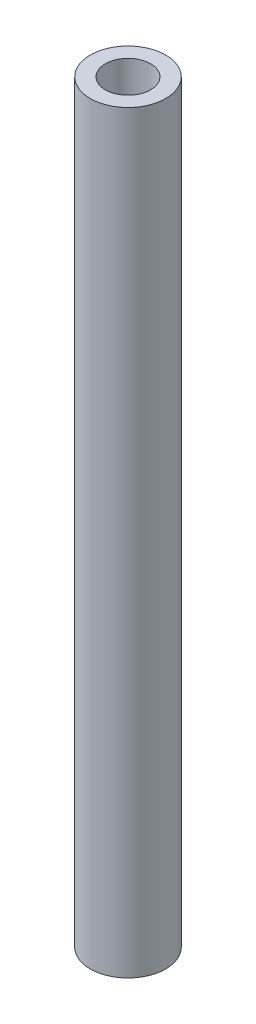
ISO-10303-21;
HEADER;
FILE_DESCRIPTION(('STEP AP214'),'2;1');
FILE_NAME('part.step','',(''),(''),'','','');
FILE_SCHEMA(('AUTOMOTIVE_DESIGN { 1 0 10303 214 1 1 1 1 }'));
ENDSEC;
DATA;
#1=APPLICATION_CONTEXT('core data for automotive mechanical design processes');
#2=APPLICATION_PROTOCOL_DEFINITION('international standard','automotive_design',2000,#1);
#3=PRODUCT_CONTEXT('',#1,'mechanical');
#4=PRODUCT('Part','Part','',(#3));
#5=PRODUCT_RELATED_PRODUCT_CATEGORY('part','',(#4));
#6=PRODUCT_DEFINITION_FORMATION('','',#4);
#7=PRODUCT_DEFINITION_CONTEXT('part definition',#1,'design');
#8=PRODUCT_DEFINITION('design','',#6,#7);
#9=PRODUCT_DEFINITION_SHAPE('','',#8);
#10=(LENGTH_UNIT() NAMED_UNIT(*) SI_UNIT(.MILLI.,.METRE.));
#11=(NAMED_UNIT(*) PLANE_ANGLE_UNIT() SI_UNIT($,.RADIAN.));
#12=(NAMED_UNIT(*) SI_UNIT($,.STERADIAN.) SOLID_ANGLE_UNIT());
#13=UNCERTAINTY_MEASURE_WITH_UNIT(LENGTH_MEASURE(1.E-05),#10,'distance_accuracy_value','');
#14=(GEOMETRIC_REPRESENTATION_CONTEXT(3) GLOBAL_UNCERTAINTY_ASSIGNED_CONTEXT((#13)) GLOBAL_UNIT_ASSIGNED_CONTEXT((#10,
#11,#12)) REPRESENTATION_CONTEXT('',''));
#15=CARTESIAN_POINT('',(0.,0.,0.));
#16=DIRECTION('',(0.,0.,1.));
#17=DIRECTION('',(1.,0.,0.));
#18=AXIS2_PLACEMENT_3D('',#15,#16,#17);
#19=CARTESIAN_POINT('',(0.,50.,0.));
#20=DIRECTION('',(0.,-1.,0.));
#21=DIRECTION('',(0.,0.,-1.));
#22=AXIS2_PLACEMENT_3D('',#19,#20,#21);
#23=CYLINDRICAL_SURFACE('',#22,2.5);
#24=CARTESIAN_POINT('',(0.,50.,0.));
#25=DIRECTION('',(0.,1.,0.));
#26=DIRECTION('',(0.,0.,1.));
#27=AXIS2_PLACEMENT_3D('',#24,#25,#26);
#28=CIRCLE('',#27,2.5);
#29=CARTESIAN_POINT('',(0.,50.,2.5));
#30=VERTEX_POINT('',#29);
#31=EDGE_CURVE('E11',#30,#30,#28,.T.);
#32=ORIENTED_EDGE('',*,*,#31,.F.);
#33=EDGE_LOOP('',(#32));
#34=FACE_BOUND('',#33,.T.);
#35=CARTESIAN_POINT('',(0.,0.,0.));
#36=DIRECTION('',(0.,1.,0.));
#37=DIRECTION('',(0.,0.,1.));
#38=AXIS2_PLACEMENT_3D('',#35,#36,#37);
#39=CIRCLE('',#38,2.5);
#40=CARTESIAN_POINT('',(0.,0.,2.5));
#41=VERTEX_POINT('',#40);
#42=EDGE_CURVE('E36',#41,#41,#39,.T.);
#43=ORIENTED_EDGE('',*,*,#42,.T.);
#44=EDGE_LOOP('',(#43));
#45=FACE_BOUND('',#44,.T.);
#46=ADVANCED_FACE('F33',(#34,#45),#23,.T.);
#47=CARTESIAN_POINT('',(0.,50.,0.));
#48=DIRECTION('',(0.,1.,0.));
#49=DIRECTION('',(0.,0.,1.));
#50=AXIS2_PLACEMENT_3D('',#47,#48,#49);
#51=PLANE('',#50);
#52=CARTESIAN_POINT('',(0.,50.,0.));
#53=DIRECTION('',(0.,1.,0.));
#54=DIRECTION('',(0.,0.,1.));
#55=AXIS2_PLACEMENT_3D('',#52,#53,#54);
#56=CIRCLE('',#55,1.50000004799999);
#57=CARTESIAN_POINT('',(0.,50.,1.50000004799999));
#58=VERTEX_POINT('',#57);
#59=EDGE_CURVE('E52',#58,#58,#56,.T.);
#60=ORIENTED_EDGE('',*,*,#59,.F.);
#61=EDGE_LOOP('',(#60));
#62=FACE_BOUND('',#61,.T.);
#63=ORIENTED_EDGE('',*,*,#31,.T.);
#64=EDGE_LOOP('',(#63));
#65=FACE_BOUND('',#64,.T.);
#66=ADVANCED_FACE('F60',(#62,#65),#51,.T.);
#67=CARTESIAN_POINT('',(0.,0.,0.));
#68=DIRECTION('',(0.,1.,0.));
#69=DIRECTION('',(0.,0.,1.));
#70=AXIS2_PLACEMENT_3D('',#67,#68,#69);
#71=PLANE('',#70);
#72=ORIENTED_EDGE('',*,*,#42,.F.);
#73=EDGE_LOOP('',(#72));
#74=FACE_BOUND('',#73,.T.);
#75=ADVANCED_FACE('F46',(#74),#71,.F.);
#76=CARTESIAN_POINT('',(0.,40.,0.));
#77=DIRECTION('',(0.,1.,0.));
#78=DIRECTION('',(0.,0.,1.));
#79=AXIS2_PLACEMENT_3D('',#76,#77,#78);
#80=CONICAL_SURFACE('',#79,1.50000004799999,1.02974425867665);
#81=CARTESIAN_POINT('',(0.,39.0987090426174,0.));
#82=VERTEX_POINT('',#81);
#83=VERTEX_LOOP('',#82);
#84=FACE_BOUND('',#83,.T.);
#85=CARTESIAN_POINT('',(0.,40.,0.));
#86=DIRECTION('',(0.,1.,0.));
#87=DIRECTION('',(0.,0.,1.));
#88=AXIS2_PLACEMENT_3D('',#85,#86,#87);
#89=CIRCLE('',#88,1.50000004799999);
#90=CARTESIAN_POINT('',(0.,40.,1.50000004799999));
#91=VERTEX_POINT('',#90);
#92=EDGE_CURVE('E50',#91,#91,#89,.T.);
#93=ORIENTED_EDGE('',*,*,#92,.T.);
#94=EDGE_LOOP('',(#93));
#95=FACE_BOUND('',#94,.T.);
#96=ADVANCED_FACE('F42',(#84,#95),#80,.F.);
#97=CARTESIAN_POINT('',(0.,50.,0.));
#98=DIRECTION('',(0.,1.,0.));
#99=DIRECTION('',(0.,0.,1.));
#100=AXIS2_PLACEMENT_3D('',#97,#98,#99);
#101=CYLINDRICAL_SURFACE('',#100,1.50000004799999);
#102=ORIENTED_EDGE('',*,*,#92,.F.);
#103=EDGE_LOOP('',(#102));
#104=FACE_BOUND('',#103,.T.);
#105=ORIENTED_EDGE('',*,*,#59,.T.);
#106=EDGE_LOOP('',(#105));
#107=FACE_BOUND('',#106,.T.);
#108=ADVANCED_FACE('F45',(#104,#107),#101,.F.);
#109=CLOSED_SHELL('',(#46,#66,#75,#96,#108));
#110=MANIFOLD_SOLID_BREP('B2',#109);
#111=ADVANCED_BREP_SHAPE_REPRESENTATION('',(#18,#110),#14);
#112=SHAPE_DEFINITION_REPRESENTATION(#9,#111);
ENDSEC;
END-ISO-10303-21;
